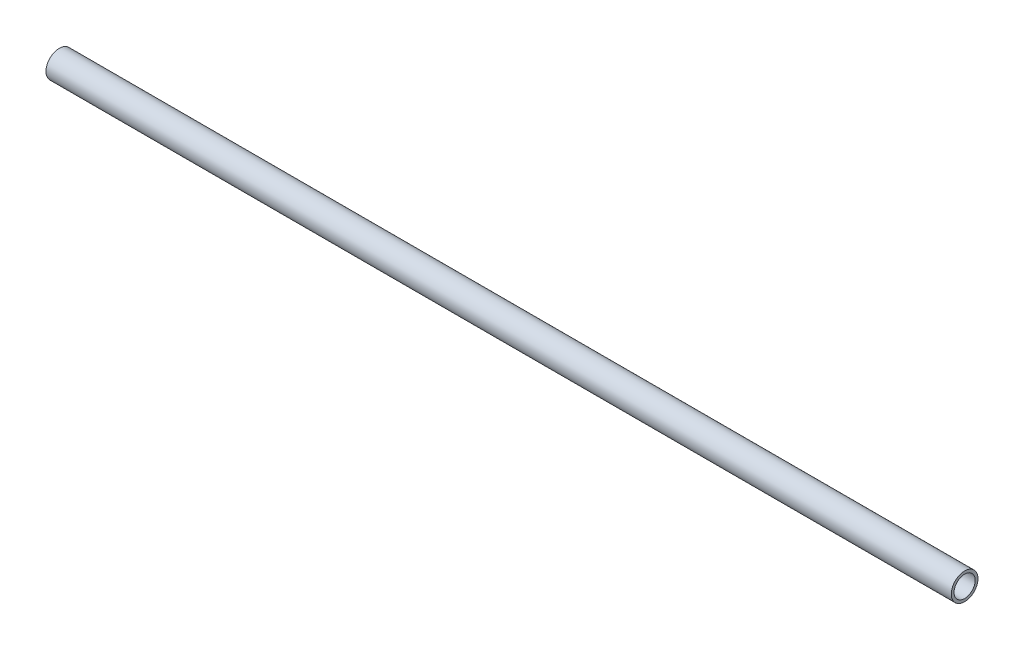
ISO-10303-21;
HEADER;
FILE_DESCRIPTION(('STEP AP214'),'2;1');
FILE_NAME('part.step','',(''),(''),'','','');
FILE_SCHEMA(('AUTOMOTIVE_DESIGN { 1 0 10303 214 1 1 1 1 }'));
ENDSEC;
DATA;
#1=APPLICATION_CONTEXT('core data for automotive mechanical design processes');
#2=APPLICATION_PROTOCOL_DEFINITION('international standard','automotive_design',2000,#1);
#3=PRODUCT_CONTEXT('',#1,'mechanical');
#4=PRODUCT('Part','Part','',(#3));
#5=PRODUCT_RELATED_PRODUCT_CATEGORY('part','',(#4));
#6=PRODUCT_DEFINITION_FORMATION('','',#4);
#7=PRODUCT_DEFINITION_CONTEXT('part definition',#1,'design');
#8=PRODUCT_DEFINITION('design','',#6,#7);
#9=PRODUCT_DEFINITION_SHAPE('','',#8);
#10=(LENGTH_UNIT() NAMED_UNIT(*) SI_UNIT(.MILLI.,.METRE.));
#11=(NAMED_UNIT(*) PLANE_ANGLE_UNIT() SI_UNIT($,.RADIAN.));
#12=(NAMED_UNIT(*) SI_UNIT($,.STERADIAN.) SOLID_ANGLE_UNIT());
#13=UNCERTAINTY_MEASURE_WITH_UNIT(LENGTH_MEASURE(1.E-05),#10,'distance_accuracy_value','');
#14=(GEOMETRIC_REPRESENTATION_CONTEXT(3) GLOBAL_UNCERTAINTY_ASSIGNED_CONTEXT((#13)) GLOBAL_UNIT_ASSIGNED_CONTEXT((#10,
#11,#12)) REPRESENTATION_CONTEXT('',''));
#15=CARTESIAN_POINT('',(0.,0.,0.));
#16=DIRECTION('',(0.,0.,1.));
#17=DIRECTION('',(1.,0.,0.));
#18=AXIS2_PLACEMENT_3D('',#15,#16,#17);
#19=CARTESIAN_POINT('',(420.,0.,0.));
#20=DIRECTION('',(1.,0.,0.));
#21=DIRECTION('',(0.,0.,-1.));
#22=AXIS2_PLACEMENT_3D('',#19,#20,#21);
#23=PLANE('',#22);
#24=CARTESIAN_POINT('',(420.,0.,0.));
#25=DIRECTION('',(1.,0.,0.));
#26=DIRECTION('',(0.,0.,-1.));
#27=AXIS2_PLACEMENT_3D('',#24,#25,#26);
#28=CIRCLE('',#27,6.2);
#29=CARTESIAN_POINT('',(420.,0.,-6.2));
#30=VERTEX_POINT('',#29);
#31=EDGE_CURVE('E10',#30,#30,#28,.T.);
#32=ORIENTED_EDGE('',*,*,#31,.T.);
#33=EDGE_LOOP('',(#32));
#34=FACE_BOUND('',#33,.T.);
#35=CARTESIAN_POINT('',(420.,0.,0.));
#36=DIRECTION('',(1.,0.,0.));
#37=DIRECTION('',(0.,0.,-1.));
#38=AXIS2_PLACEMENT_3D('',#35,#36,#37);
#39=CIRCLE('',#38,4.89812626659665);
#40=CARTESIAN_POINT('',(420.,0.,-4.89812626659665));
#41=VERTEX_POINT('',#40);
#42=EDGE_CURVE('E42',#41,#41,#39,.T.);
#43=ORIENTED_EDGE('',*,*,#42,.F.);
#44=EDGE_LOOP('',(#43));
#45=FACE_BOUND('',#44,.T.);
#46=ADVANCED_FACE('F31',(#34,#45),#23,.T.);
#47=CARTESIAN_POINT('',(0.,0.,0.));
#48=DIRECTION('',(1.,0.,0.));
#49=DIRECTION('',(0.,0.,-1.));
#50=AXIS2_PLACEMENT_3D('',#47,#48,#49);
#51=PLANE('',#50);
#52=CARTESIAN_POINT('',(0.,0.,0.));
#53=DIRECTION('',(1.,0.,0.));
#54=DIRECTION('',(0.,0.,-1.));
#55=AXIS2_PLACEMENT_3D('',#52,#53,#54);
#56=CIRCLE('',#55,6.2);
#57=CARTESIAN_POINT('',(0.,0.,-6.2));
#58=VERTEX_POINT('',#57);
#59=EDGE_CURVE('E35',#58,#58,#56,.T.);
#60=ORIENTED_EDGE('',*,*,#59,.F.);
#61=EDGE_LOOP('',(#60));
#62=FACE_BOUND('',#61,.T.);
#63=CARTESIAN_POINT('',(0.,0.,0.));
#64=DIRECTION('',(1.,0.,0.));
#65=DIRECTION('',(0.,0.,-1.));
#66=AXIS2_PLACEMENT_3D('',#63,#64,#65);
#67=CIRCLE('',#66,4.89812626659665);
#68=CARTESIAN_POINT('',(0.,0.,-4.89812626659665));
#69=VERTEX_POINT('',#68);
#70=EDGE_CURVE('E44',#69,#69,#67,.T.);
#71=ORIENTED_EDGE('',*,*,#70,.T.);
#72=EDGE_LOOP('',(#71));
#73=FACE_BOUND('',#72,.T.);
#74=ADVANCED_FACE('F54',(#62,#73),#51,.F.);
#75=CARTESIAN_POINT('',(420.,0.,0.));
#76=DIRECTION('',(-1.,0.,0.));
#77=DIRECTION('',(0.,0.,1.));
#78=AXIS2_PLACEMENT_3D('',#75,#76,#77);
#79=CYLINDRICAL_SURFACE('',#78,6.2);
#80=ORIENTED_EDGE('',*,*,#31,.F.);
#81=EDGE_LOOP('',(#80));
#82=FACE_BOUND('',#81,.T.);
#83=ORIENTED_EDGE('',*,*,#59,.T.);
#84=EDGE_LOOP('',(#83));
#85=FACE_BOUND('',#84,.T.);
#86=ADVANCED_FACE('F33',(#82,#85),#79,.T.);
#87=CARTESIAN_POINT('',(420.,0.,0.));
#88=DIRECTION('',(-1.,0.,0.));
#89=DIRECTION('',(0.,0.,1.));
#90=AXIS2_PLACEMENT_3D('',#87,#88,#89);
#91=CYLINDRICAL_SURFACE('',#90,4.89812626659665);
#92=ORIENTED_EDGE('',*,*,#42,.T.);
#93=EDGE_LOOP('',(#92));
#94=FACE_BOUND('',#93,.T.);
#95=ORIENTED_EDGE('',*,*,#70,.F.);
#96=EDGE_LOOP('',(#95));
#97=FACE_BOUND('',#96,.T.);
#98=ADVANCED_FACE('F50',(#94,#97),#91,.F.);
#99=CLOSED_SHELL('',(#46,#74,#86,#98));
#100=MANIFOLD_SOLID_BREP('B2',#99);
#101=ADVANCED_BREP_SHAPE_REPRESENTATION('',(#18,#100),#14);
#102=SHAPE_DEFINITION_REPRESENTATION(#9,#101);
ENDSEC;
END-ISO-10303-21;
